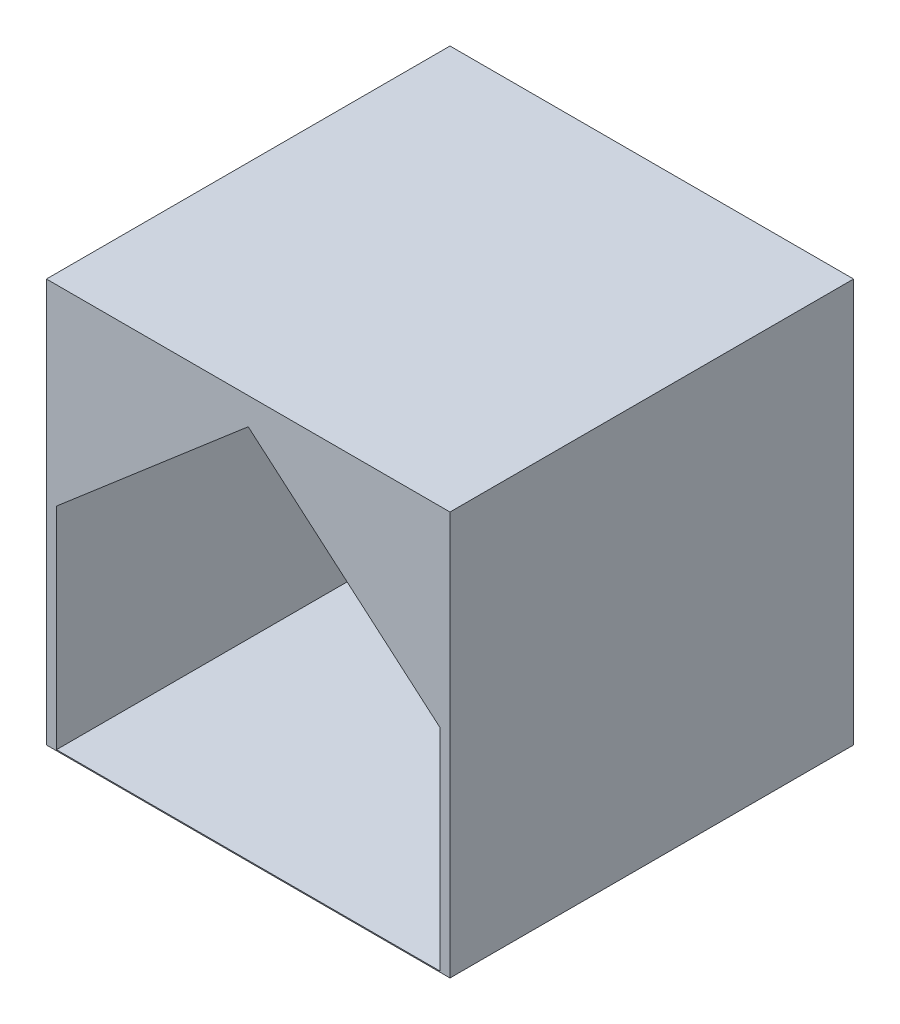
ISO-10303-21;
HEADER;
FILE_DESCRIPTION(('STEP AP214'),'2;1');
FILE_NAME('part.step','',(''),(''),'','','');
FILE_SCHEMA(('AUTOMOTIVE_DESIGN { 1 0 10303 214 1 1 1 1 }'));
ENDSEC;
DATA;
#1=APPLICATION_CONTEXT('core data for automotive mechanical design processes');
#2=APPLICATION_PROTOCOL_DEFINITION('international standard','automotive_design',2000,#1);
#3=PRODUCT_CONTEXT('',#1,'mechanical');
#4=PRODUCT('Part','Part','',(#3));
#5=PRODUCT_RELATED_PRODUCT_CATEGORY('part','',(#4));
#6=PRODUCT_DEFINITION_FORMATION('','',#4);
#7=PRODUCT_DEFINITION_CONTEXT('part definition',#1,'design');
#8=PRODUCT_DEFINITION('design','',#6,#7);
#9=PRODUCT_DEFINITION_SHAPE('','',#8);
#10=(LENGTH_UNIT() NAMED_UNIT(*) SI_UNIT(.MILLI.,.METRE.));
#11=(NAMED_UNIT(*) PLANE_ANGLE_UNIT() SI_UNIT($,.RADIAN.));
#12=(NAMED_UNIT(*) SI_UNIT($,.STERADIAN.) SOLID_ANGLE_UNIT());
#13=UNCERTAINTY_MEASURE_WITH_UNIT(LENGTH_MEASURE(1.E-05),#10,'distance_accuracy_value','');
#14=(GEOMETRIC_REPRESENTATION_CONTEXT(3) GLOBAL_UNCERTAINTY_ASSIGNED_CONTEXT((#13)) GLOBAL_UNIT_ASSIGNED_CONTEXT((#10,
#11,#12)) REPRESENTATION_CONTEXT('',''));
#15=CARTESIAN_POINT('',(0.,0.,0.));
#16=DIRECTION('',(0.,0.,1.));
#17=DIRECTION('',(1.,0.,0.));
#18=AXIS2_PLACEMENT_3D('',#15,#16,#17);
#19=CARTESIAN_POINT('',(0.,0.,2000.));
#20=DIRECTION('',(0.,0.,1.));
#21=DIRECTION('',(1.,0.,0.));
#22=AXIS2_PLACEMENT_3D('',#19,#20,#21);
#23=PLANE('',#22);
#24=DIRECTION('',(0.,-1.,0.));
#25=VECTOR('',#24,1.);
#26=CARTESIAN_POINT('',(-1000.,-1000.,2000.));
#27=LINE('',#26,#25);
#28=CARTESIAN_POINT('',(-1000.,1000.,2000.));
#29=VERTEX_POINT('',#28);
#30=CARTESIAN_POINT('',(-1000.,-1000.,2000.));
#31=VERTEX_POINT('',#30);
#32=EDGE_CURVE('E160',#29,#31,#27,.T.);
#33=ORIENTED_EDGE('',*,*,#32,.T.);
#34=DIRECTION('',(1.,0.,0.));
#35=VECTOR('',#34,1.);
#36=CARTESIAN_POINT('',(1000.,-1000.,2000.));
#37=LINE('',#36,#35);
#38=CARTESIAN_POINT('',(1000.,-1000.,2000.));
#39=VERTEX_POINT('',#38);
#40=EDGE_CURVE('E88',#31,#39,#37,.T.);
#41=ORIENTED_EDGE('',*,*,#40,.T.);
#42=DIRECTION('',(0.,1.,0.));
#43=VECTOR('',#42,1.);
#44=CARTESIAN_POINT('',(1000.,-1000.,2000.));
#45=LINE('',#44,#43);
#46=CARTESIAN_POINT('',(1000.,1000.,2000.));
#47=VERTEX_POINT('',#46);
#48=EDGE_CURVE('E163',#39,#47,#45,.T.);
#49=ORIENTED_EDGE('',*,*,#48,.T.);
#50=DIRECTION('',(-1.,0.,0.));
#51=VECTOR('',#50,1.);
#52=CARTESIAN_POINT('',(1000.,1000.,2000.));
#53=LINE('',#52,#51);
#54=EDGE_CURVE('E59',#47,#29,#53,.T.);
#55=ORIENTED_EDGE('',*,*,#54,.T.);
#56=EDGE_LOOP('',(#33,#41,#49,#55));
#57=FACE_BOUND('',#56,.T.);
#58=DIRECTION('',(0.,1.,0.));
#59=VECTOR('',#58,1.);
#60=CARTESIAN_POINT('',(950.,2.01762059646523E-13,2000.));
#61=LINE('',#60,#59);
#62=CARTESIAN_POINT('',(950.,-995.,2000.));
#63=VERTEX_POINT('',#62);
#64=CARTESIAN_POINT('',(950.,50.5007004207842,2000.));
#65=VERTEX_POINT('',#64);
#66=EDGE_CURVE('E43',#63,#65,#61,.T.);
#67=ORIENTED_EDGE('',*,*,#66,.F.);
#68=DIRECTION('',(-1.,0.,0.));
#69=VECTOR('',#68,1.);
#70=CARTESIAN_POINT('',(1.16281253631793E-13,-995.,2000.));
#71=LINE('',#70,#69);
#72=CARTESIAN_POINT('',(-950.,-995.,2000.));
#73=VERTEX_POINT('',#72);
#74=EDGE_CURVE('E12',#63,#73,#71,.T.);
#75=ORIENTED_EDGE('',*,*,#74,.T.);
#76=DIRECTION('',(0.,-1.,0.));
#77=VECTOR('',#76,1.);
#78=CARTESIAN_POINT('',(-950.,0.,2000.));
#79=LINE('',#78,#77);
#80=CARTESIAN_POINT('',(-950.,50.500700420784,2000.));
#81=VERTEX_POINT('',#80);
#82=EDGE_CURVE('E182',#81,#73,#79,.T.);
#83=ORIENTED_EDGE('',*,*,#82,.F.);
#84=DIRECTION('',(-0.75881654460311,-0.651304423166768,0.));
#85=VECTOR('',#84,1.);
#86=CARTESIAN_POINT('',(-427.946064096669,498.587975274946,2000.));
#87=LINE('',#86,#85);
#88=CARTESIAN_POINT('',(0.,865.900952838913,2000.));
#89=VERTEX_POINT('',#88);
#90=EDGE_CURVE('E184',#89,#81,#87,.T.);
#91=ORIENTED_EDGE('',*,*,#90,.F.);
#92=DIRECTION('',(-0.75881654460311,0.651304423166768,0.));
#93=VECTOR('',#92,1.);
#94=CARTESIAN_POINT('',(427.946064096669,498.587975274946,2000.));
#95=LINE('',#94,#93);
#96=EDGE_CURVE('E186',#65,#89,#95,.T.);
#97=ORIENTED_EDGE('',*,*,#96,.F.);
#98=EDGE_LOOP('',(#67,#75,#83,#91,#97));
#99=FACE_BOUND('',#98,.T.);
#100=ADVANCED_FACE('F35',(#57,#99),#23,.T.);
#101=CARTESIAN_POINT('',(-1000.,-1000.,2000.));
#102=DIRECTION('',(1.,0.,0.));
#103=DIRECTION('',(0.,0.,-1.));
#104=AXIS2_PLACEMENT_3D('',#101,#102,#103);
#105=PLANE('',#104);
#106=DIRECTION('',(0.,-1.,0.));
#107=VECTOR('',#106,1.);
#108=CARTESIAN_POINT('',(-1000.,-1000.,0.));
#109=LINE('',#108,#107);
#110=CARTESIAN_POINT('',(-1000.,1000.,0.));
#111=VERTEX_POINT('',#110);
#112=CARTESIAN_POINT('',(-1000.,-1000.,0.));
#113=VERTEX_POINT('',#112);
#114=EDGE_CURVE('E124',#111,#113,#109,.T.);
#115=ORIENTED_EDGE('',*,*,#114,.T.);
#116=DIRECTION('',(0.,0.,-1.));
#117=VECTOR('',#116,1.);
#118=CARTESIAN_POINT('',(-1000.,-1000.,2000.));
#119=LINE('',#118,#117);
#120=EDGE_CURVE('E180',#31,#113,#119,.T.);
#121=ORIENTED_EDGE('',*,*,#120,.F.);
#122=ORIENTED_EDGE('',*,*,#32,.F.);
#123=DIRECTION('',(0.,0.,-1.));
#124=VECTOR('',#123,1.);
#125=CARTESIAN_POINT('',(-1000.,1000.,2000.));
#126=LINE('',#125,#124);
#127=EDGE_CURVE('E166',#29,#111,#126,.T.);
#128=ORIENTED_EDGE('',*,*,#127,.T.);
#129=EDGE_LOOP('',(#115,#121,#122,#128));
#130=FACE_BOUND('',#129,.T.);
#131=ADVANCED_FACE('F37',(#130),#105,.F.);
#132=CARTESIAN_POINT('',(1000.,-1000.,2000.));
#133=DIRECTION('',(0.,1.,0.));
#134=DIRECTION('',(-1.,0.,0.));
#135=AXIS2_PLACEMENT_3D('',#132,#133,#134);
#136=PLANE('',#135);
#137=DIRECTION('',(1.,0.,0.));
#138=VECTOR('',#137,1.);
#139=CARTESIAN_POINT('',(1000.,-1000.,0.));
#140=LINE('',#139,#138);
#141=CARTESIAN_POINT('',(1000.,-1000.,0.));
#142=VERTEX_POINT('',#141);
#143=EDGE_CURVE('E169',#113,#142,#140,.T.);
#144=ORIENTED_EDGE('',*,*,#143,.T.);
#145=DIRECTION('',(0.,0.,-1.));
#146=VECTOR('',#145,1.);
#147=CARTESIAN_POINT('',(1000.,-1000.,2000.));
#148=LINE('',#147,#146);
#149=EDGE_CURVE('E177',#39,#142,#148,.T.);
#150=ORIENTED_EDGE('',*,*,#149,.F.);
#151=ORIENTED_EDGE('',*,*,#40,.F.);
#152=ORIENTED_EDGE('',*,*,#120,.T.);
#153=EDGE_LOOP('',(#144,#150,#151,#152));
#154=FACE_BOUND('',#153,.T.);
#155=ADVANCED_FACE('F212',(#154),#136,.F.);
#156=CARTESIAN_POINT('',(1000.,-1000.,2000.));
#157=DIRECTION('',(-1.,0.,0.));
#158=DIRECTION('',(0.,0.,1.));
#159=AXIS2_PLACEMENT_3D('',#156,#157,#158);
#160=PLANE('',#159);
#161=DIRECTION('',(0.,1.,0.));
#162=VECTOR('',#161,1.);
#163=CARTESIAN_POINT('',(1000.,-1000.,0.));
#164=LINE('',#163,#162);
#165=CARTESIAN_POINT('',(1000.,1000.,0.));
#166=VERTEX_POINT('',#165);
#167=EDGE_CURVE('E171',#142,#166,#164,.T.);
#168=ORIENTED_EDGE('',*,*,#167,.T.);
#169=DIRECTION('',(0.,0.,-1.));
#170=VECTOR('',#169,1.);
#171=CARTESIAN_POINT('',(1000.,1000.,2000.));
#172=LINE('',#171,#170);
#173=EDGE_CURVE('E175',#47,#166,#172,.T.);
#174=ORIENTED_EDGE('',*,*,#173,.F.);
#175=ORIENTED_EDGE('',*,*,#48,.F.);
#176=ORIENTED_EDGE('',*,*,#149,.T.);
#177=EDGE_LOOP('',(#168,#174,#175,#176));
#178=FACE_BOUND('',#177,.T.);
#179=ADVANCED_FACE('F224',(#178),#160,.F.);
#180=CARTESIAN_POINT('',(1000.,1000.,2000.));
#181=DIRECTION('',(0.,-1.,0.));
#182=DIRECTION('',(1.,0.,0.));
#183=AXIS2_PLACEMENT_3D('',#180,#181,#182);
#184=PLANE('',#183);
#185=DIRECTION('',(-1.,0.,0.));
#186=VECTOR('',#185,1.);
#187=CARTESIAN_POINT('',(1000.,1000.,0.));
#188=LINE('',#187,#186);
#189=EDGE_CURVE('E80',#166,#111,#188,.T.);
#190=ORIENTED_EDGE('',*,*,#189,.T.);
#191=ORIENTED_EDGE('',*,*,#127,.F.);
#192=ORIENTED_EDGE('',*,*,#54,.F.);
#193=ORIENTED_EDGE('',*,*,#173,.T.);
#194=EDGE_LOOP('',(#190,#191,#192,#193));
#195=FACE_BOUND('',#194,.T.);
#196=ADVANCED_FACE('F220',(#195),#184,.F.);
#197=CARTESIAN_POINT('',(0.,0.,0.));
#198=DIRECTION('',(0.,0.,1.));
#199=DIRECTION('',(1.,0.,0.));
#200=AXIS2_PLACEMENT_3D('',#197,#198,#199);
#201=PLANE('',#200);
#202=ORIENTED_EDGE('',*,*,#114,.F.);
#203=ORIENTED_EDGE('',*,*,#189,.F.);
#204=ORIENTED_EDGE('',*,*,#167,.F.);
#205=ORIENTED_EDGE('',*,*,#143,.F.);
#206=EDGE_LOOP('',(#202,#203,#204,#205));
#207=FACE_BOUND('',#206,.T.);
#208=ADVANCED_FACE('F217',(#207),#201,.F.);
#209=CARTESIAN_POINT('',(1.16281253631793E-13,-995.,2000.000012));
#210=DIRECTION('',(0.,1.,0.));
#211=DIRECTION('',(-1.,0.,0.));
#212=AXIS2_PLACEMENT_3D('',#209,#210,#211);
#213=PLANE('',#212);
#214=DIRECTION('',(0.,0.,-1.));
#215=VECTOR('',#214,1.);
#216=CARTESIAN_POINT('',(950.,-995.,2000.000012));
#217=LINE('',#216,#215);
#218=CARTESIAN_POINT('',(950.,-995.,4.99999999999989));
#219=VERTEX_POINT('',#218);
#220=EDGE_CURVE('E116',#63,#219,#217,.T.);
#221=ORIENTED_EDGE('',*,*,#220,.T.);
#222=DIRECTION('',(1.,0.,0.));
#223=VECTOR('',#222,1.);
#224=CARTESIAN_POINT('',(1.16281253631793E-13,-995.,4.99999999999989));
#225=LINE('',#224,#223);
#226=CARTESIAN_POINT('',(-950.,-995.,4.99999999999989));
#227=VERTEX_POINT('',#226);
#228=EDGE_CURVE('E121',#227,#219,#225,.T.);
#229=ORIENTED_EDGE('',*,*,#228,.F.);
#230=DIRECTION('',(0.,0.,-1.));
#231=VECTOR('',#230,1.);
#232=CARTESIAN_POINT('',(-950.,-995.,2000.000012));
#233=LINE('',#232,#231);
#234=EDGE_CURVE('E154',#73,#227,#233,.T.);
#235=ORIENTED_EDGE('',*,*,#234,.F.);
#236=ORIENTED_EDGE('',*,*,#74,.F.);
#237=EDGE_LOOP('',(#221,#229,#235,#236));
#238=FACE_BOUND('',#237,.T.);
#239=ADVANCED_FACE('F118',(#238),#213,.T.);
#240=CARTESIAN_POINT('',(950.,2.01762059646523E-13,2000.000012));
#241=DIRECTION('',(1.,0.,0.));
#242=DIRECTION('',(0.,1.,0.));
#243=AXIS2_PLACEMENT_3D('',#240,#241,#242);
#244=PLANE('',#243);
#245=ORIENTED_EDGE('',*,*,#66,.T.);
#246=DIRECTION('',(0.,0.,-1.));
#247=VECTOR('',#246,1.);
#248=CARTESIAN_POINT('',(950.,50.5007004207842,2000.000012));
#249=LINE('',#248,#247);
#250=CARTESIAN_POINT('',(950.,50.5007004207842,4.99999999999989));
#251=VERTEX_POINT('',#250);
#252=EDGE_CURVE('E125',#65,#251,#249,.T.);
#253=ORIENTED_EDGE('',*,*,#252,.T.);
#254=DIRECTION('',(0.,-1.,0.));
#255=VECTOR('',#254,1.);
#256=CARTESIAN_POINT('',(950.,2.01762059646523E-13,4.99999999999989));
#257=LINE('',#256,#255);
#258=EDGE_CURVE('E128',#251,#219,#257,.T.);
#259=ORIENTED_EDGE('',*,*,#258,.T.);
#260=ORIENTED_EDGE('',*,*,#220,.F.);
#261=EDGE_LOOP('',(#245,#253,#259,#260));
#262=FACE_BOUND('',#261,.T.);
#263=ADVANCED_FACE('F129',(#262),#244,.F.);
#264=CARTESIAN_POINT('',(427.946064096669,498.587975274946,2000.000012));
#265=DIRECTION('',(0.651304423166768,0.75881654460311,0.));
#266=DIRECTION('',(-0.75881654460311,0.651304423166768,0.));
#267=AXIS2_PLACEMENT_3D('',#264,#265,#266);
#268=PLANE('',#267);
#269=CARTESIAN_POINT('',(475.,458.200826629849,1500.));
#270=DIRECTION('',(-0.651304423166768,-0.758816544603111,0.));
#271=DIRECTION('',(0.758816544603111,-0.651304423166768,0.));
#272=AXIS2_PLACEMENT_3D('',#269,#270,#271);
#273=CIRCLE('',#272,100.);
#274=CARTESIAN_POINT('',(550.881654460311,393.070384313172,1500.));
#275=VERTEX_POINT('',#274);
#276=EDGE_CURVE('E143',#275,#275,#273,.T.);
#277=ORIENTED_EDGE('',*,*,#276,.F.);
#278=EDGE_LOOP('',(#277));
#279=FACE_BOUND('',#278,.T.);
#280=CARTESIAN_POINT('',(475.,458.200826629849,1002.5));
#281=DIRECTION('',(-0.651304423166768,-0.758816544603111,0.));
#282=DIRECTION('',(0.758816544603111,-0.651304423166768,0.));
#283=AXIS2_PLACEMENT_3D('',#280,#281,#282);
#284=CIRCLE('',#283,100.);
#285=CARTESIAN_POINT('',(550.881654460311,393.070384313172,1002.5));
#286=VERTEX_POINT('',#285);
#287=EDGE_CURVE('E375',#286,#286,#284,.T.);
#288=ORIENTED_EDGE('',*,*,#287,.F.);
#289=EDGE_LOOP('',(#288));
#290=FACE_BOUND('',#289,.T.);
#291=CARTESIAN_POINT('',(475.,458.200826629849,502.5));
#292=DIRECTION('',(-0.651304423166768,-0.758816544603111,0.));
#293=DIRECTION('',(0.758816544603111,-0.651304423166768,0.));
#294=AXIS2_PLACEMENT_3D('',#291,#292,#293);
#295=CIRCLE('',#294,100.);
#296=CARTESIAN_POINT('',(550.881654460311,393.070384313172,502.5));
#297=VERTEX_POINT('',#296);
#298=EDGE_CURVE('E146',#297,#297,#295,.T.);
#299=ORIENTED_EDGE('',*,*,#298,.F.);
#300=EDGE_LOOP('',(#299));
#301=FACE_BOUND('',#300,.T.);
#302=ORIENTED_EDGE('',*,*,#96,.T.);
#303=DIRECTION('',(0.,0.,-1.));
#304=VECTOR('',#303,1.);
#305=CARTESIAN_POINT('',(0.,865.900952838913,2000.000012));
#306=LINE('',#305,#304);
#307=CARTESIAN_POINT('',(0.,865.900952838913,4.99999999999989));
#308=VERTEX_POINT('',#307);
#309=EDGE_CURVE('E157',#89,#308,#306,.T.);
#310=ORIENTED_EDGE('',*,*,#309,.T.);
#311=DIRECTION('',(0.75881654460311,-0.651304423166768,0.));
#312=VECTOR('',#311,1.);
#313=CARTESIAN_POINT('',(427.946064096669,498.587975274946,4.99999999999989));
#314=LINE('',#313,#312);
#315=EDGE_CURVE('E134',#308,#251,#314,.T.);
#316=ORIENTED_EDGE('',*,*,#315,.T.);
#317=ORIENTED_EDGE('',*,*,#252,.F.);
#318=EDGE_LOOP('',(#302,#310,#316,#317));
#319=FACE_BOUND('',#318,.T.);
#320=ADVANCED_FACE('F190',(#279,#290,#301,#319),#268,.F.);
#321=CARTESIAN_POINT('',(-427.946064096669,498.587975274946,2000.000012));
#322=DIRECTION('',(-0.651304423166768,0.75881654460311,0.));
#323=DIRECTION('',(-0.75881654460311,-0.651304423166768,0.));
#324=AXIS2_PLACEMENT_3D('',#321,#322,#323);
#325=PLANE('',#324);
#326=CARTESIAN_POINT('',(-475.,458.200826629849,1500.));
#327=DIRECTION('',(0.651304423166768,-0.75881654460311,0.));
#328=DIRECTION('',(0.75881654460311,0.651304423166768,0.));
#329=AXIS2_PLACEMENT_3D('',#326,#327,#328);
#330=CIRCLE('',#329,100.);
#331=CARTESIAN_POINT('',(-399.118345539689,523.331268946525,1500.));
#332=VERTEX_POINT('',#331);
#333=EDGE_CURVE('E376',#332,#332,#330,.T.);
#334=ORIENTED_EDGE('',*,*,#333,.F.);
#335=EDGE_LOOP('',(#334));
#336=FACE_BOUND('',#335,.T.);
#337=CARTESIAN_POINT('',(-475.,458.200826629849,1000.));
#338=DIRECTION('',(0.651304423166768,-0.75881654460311,0.));
#339=DIRECTION('',(0.75881654460311,0.651304423166768,0.));
#340=AXIS2_PLACEMENT_3D('',#337,#338,#339);
#341=CIRCLE('',#340,100.);
#342=CARTESIAN_POINT('',(-399.118345539689,523.331268946525,1000.));
#343=VERTEX_POINT('',#342);
#344=EDGE_CURVE('E385',#343,#343,#341,.T.);
#345=ORIENTED_EDGE('',*,*,#344,.F.);
#346=EDGE_LOOP('',(#345));
#347=FACE_BOUND('',#346,.T.);
#348=CARTESIAN_POINT('',(-475.,458.200826629849,502.5));
#349=DIRECTION('',(0.651304423166768,-0.75881654460311,0.));
#350=DIRECTION('',(0.75881654460311,0.651304423166768,0.));
#351=AXIS2_PLACEMENT_3D('',#348,#349,#350);
#352=CIRCLE('',#351,100.);
#353=CARTESIAN_POINT('',(-399.118345539689,523.331268946525,502.5));
#354=VERTEX_POINT('',#353);
#355=EDGE_CURVE('E391',#354,#354,#352,.T.);
#356=ORIENTED_EDGE('',*,*,#355,.F.);
#357=EDGE_LOOP('',(#356));
#358=FACE_BOUND('',#357,.T.);
#359=ORIENTED_EDGE('',*,*,#90,.T.);
#360=DIRECTION('',(0.,0.,-1.));
#361=VECTOR('',#360,1.);
#362=CARTESIAN_POINT('',(-950.,50.500700420784,2000.000012));
#363=LINE('',#362,#361);
#364=CARTESIAN_POINT('',(-950.,50.500700420784,4.99999999999989));
#365=VERTEX_POINT('',#364);
#366=EDGE_CURVE('E50',#81,#365,#363,.T.);
#367=ORIENTED_EDGE('',*,*,#366,.T.);
#368=DIRECTION('',(0.75881654460311,0.651304423166768,0.));
#369=VECTOR('',#368,1.);
#370=CARTESIAN_POINT('',(-427.946064096669,498.587975274946,4.99999999999989));
#371=LINE('',#370,#369);
#372=EDGE_CURVE('E150',#365,#308,#371,.T.);
#373=ORIENTED_EDGE('',*,*,#372,.T.);
#374=ORIENTED_EDGE('',*,*,#309,.F.);
#375=EDGE_LOOP('',(#359,#367,#373,#374));
#376=FACE_BOUND('',#375,.T.);
#377=ADVANCED_FACE('F195',(#336,#347,#358,#376),#325,.F.);
#378=CARTESIAN_POINT('',(-950.,0.,2000.000012));
#379=DIRECTION('',(-1.,0.,0.));
#380=DIRECTION('',(0.,0.,1.));
#381=AXIS2_PLACEMENT_3D('',#378,#379,#380);
#382=PLANE('',#381);
#383=ORIENTED_EDGE('',*,*,#82,.T.);
#384=ORIENTED_EDGE('',*,*,#234,.T.);
#385=DIRECTION('',(0.,1.,0.));
#386=VECTOR('',#385,1.);
#387=CARTESIAN_POINT('',(-950.,0.,4.99999999999989));
#388=LINE('',#387,#386);
#389=EDGE_CURVE('E139',#227,#365,#388,.T.);
#390=ORIENTED_EDGE('',*,*,#389,.T.);
#391=ORIENTED_EDGE('',*,*,#366,.F.);
#392=EDGE_LOOP('',(#383,#384,#390,#391));
#393=FACE_BOUND('',#392,.T.);
#394=ADVANCED_FACE('F196',(#393),#382,.F.);
#395=CARTESIAN_POINT('',(0.,0.,4.99999999999989));
#396=DIRECTION('',(0.,0.,1.));
#397=DIRECTION('',(1.,0.,0.));
#398=AXIS2_PLACEMENT_3D('',#395,#396,#397);
#399=PLANE('',#398);
#400=ORIENTED_EDGE('',*,*,#228,.T.);
#401=ORIENTED_EDGE('',*,*,#258,.F.);
#402=ORIENTED_EDGE('',*,*,#315,.F.);
#403=ORIENTED_EDGE('',*,*,#372,.F.);
#404=ORIENTED_EDGE('',*,*,#389,.F.);
#405=EDGE_LOOP('',(#400,#401,#402,#403,#404));
#406=FACE_BOUND('',#405,.T.);
#407=ADVANCED_FACE('F137',(#406),#399,.T.);
#408=CARTESIAN_POINT('',(488.026088463335,473.377157521911,502.5));
#409=DIRECTION('',(-0.651304423166768,-0.758816544603111,0.));
#410=DIRECTION('',(0.758816544603111,-0.651304423166768,0.));
#411=AXIS2_PLACEMENT_3D('',#408,#409,#410);
#412=CYLINDRICAL_SURFACE('',#411,100.);
#413=CARTESIAN_POINT('',(488.026088463335,473.377157521911,502.5));
#414=DIRECTION('',(-0.651304423166768,-0.758816544603111,0.));
#415=DIRECTION('',(0.758816544603111,-0.651304423166768,0.));
#416=AXIS2_PLACEMENT_3D('',#413,#414,#415);
#417=CIRCLE('',#416,100.);
#418=CARTESIAN_POINT('',(563.907742923647,408.246715205234,502.5));
#419=VERTEX_POINT('',#418);
#420=EDGE_CURVE('E370',#419,#419,#417,.T.);
#421=ORIENTED_EDGE('',*,*,#420,.F.);
#422=EDGE_LOOP('',(#421));
#423=FACE_BOUND('',#422,.T.);
#424=ORIENTED_EDGE('',*,*,#298,.T.);
#425=EDGE_LOOP('',(#424));
#426=FACE_BOUND('',#425,.T.);
#427=ADVANCED_FACE('F203',(#423,#426),#412,.F.);
#428=CARTESIAN_POINT('',(488.026088463335,473.377157521911,502.5));
#429=DIRECTION('',(-0.651304423166768,-0.758816544603111,0.));
#430=DIRECTION('',(0.758816544603111,-0.651304423166768,0.));
#431=AXIS2_PLACEMENT_3D('',#428,#429,#430);
#432=PLANE('',#431);
#433=ORIENTED_EDGE('',*,*,#420,.T.);
#434=EDGE_LOOP('',(#433));
#435=FACE_BOUND('',#434,.T.);
#436=ADVANCED_FACE('F359',(#435),#432,.T.);
#437=CARTESIAN_POINT('',(488.026088463335,473.377157521911,1002.5));
#438=DIRECTION('',(-0.651304423166768,-0.758816544603111,0.));
#439=DIRECTION('',(0.758816544603111,-0.651304423166768,0.));
#440=AXIS2_PLACEMENT_3D('',#437,#438,#439);
#441=CYLINDRICAL_SURFACE('',#440,100.);
#442=CARTESIAN_POINT('',(488.026088463335,473.377157521911,1002.5));
#443=DIRECTION('',(-0.651304423166768,-0.758816544603111,0.));
#444=DIRECTION('',(0.758816544603111,-0.651304423166768,0.));
#445=AXIS2_PLACEMENT_3D('',#442,#443,#444);
#446=CIRCLE('',#445,100.);
#447=CARTESIAN_POINT('',(563.907742923646,408.246715205234,1002.5));
#448=VERTEX_POINT('',#447);
#449=EDGE_CURVE('E396',#448,#448,#446,.T.);
#450=ORIENTED_EDGE('',*,*,#449,.F.);
#451=EDGE_LOOP('',(#450));
#452=FACE_BOUND('',#451,.T.);
#453=ORIENTED_EDGE('',*,*,#287,.T.);
#454=EDGE_LOOP('',(#453));
#455=FACE_BOUND('',#454,.T.);
#456=ADVANCED_FACE('F355',(#452,#455),#441,.F.);
#457=CARTESIAN_POINT('',(488.026088463335,473.377157521911,1002.5));
#458=DIRECTION('',(-0.651304423166768,-0.758816544603111,0.));
#459=DIRECTION('',(0.758816544603111,-0.651304423166768,0.));
#460=AXIS2_PLACEMENT_3D('',#457,#458,#459);
#461=PLANE('',#460);
#462=ORIENTED_EDGE('',*,*,#449,.T.);
#463=EDGE_LOOP('',(#462));
#464=FACE_BOUND('',#463,.T.);
#465=ADVANCED_FACE('F351',(#464),#461,.T.);
#466=CARTESIAN_POINT('',(488.026088463335,473.377157521911,1500.));
#467=DIRECTION('',(-0.651304423166768,-0.758816544603111,0.));
#468=DIRECTION('',(0.758816544603111,-0.651304423166768,0.));
#469=AXIS2_PLACEMENT_3D('',#466,#467,#468);
#470=CYLINDRICAL_SURFACE('',#469,100.);
#471=CARTESIAN_POINT('',(488.026088463335,473.377157521911,1500.));
#472=DIRECTION('',(-0.651304423166768,-0.758816544603111,0.));
#473=DIRECTION('',(0.758816544603111,-0.651304423166768,0.));
#474=AXIS2_PLACEMENT_3D('',#471,#472,#473);
#475=CIRCLE('',#474,100.);
#476=CARTESIAN_POINT('',(563.907742923647,408.246715205234,1500.));
#477=VERTEX_POINT('',#476);
#478=EDGE_CURVE('E140',#477,#477,#475,.T.);
#479=ORIENTED_EDGE('',*,*,#478,.F.);
#480=EDGE_LOOP('',(#479));
#481=FACE_BOUND('',#480,.T.);
#482=ORIENTED_EDGE('',*,*,#276,.T.);
#483=EDGE_LOOP('',(#482));
#484=FACE_BOUND('',#483,.T.);
#485=ADVANCED_FACE('F347',(#481,#484),#470,.F.);
#486=CARTESIAN_POINT('',(488.026088463335,473.377157521911,1500.));
#487=DIRECTION('',(-0.651304423166768,-0.758816544603111,0.));
#488=DIRECTION('',(0.758816544603111,-0.651304423166768,0.));
#489=AXIS2_PLACEMENT_3D('',#486,#487,#488);
#490=PLANE('',#489);
#491=ORIENTED_EDGE('',*,*,#478,.T.);
#492=EDGE_LOOP('',(#491));
#493=FACE_BOUND('',#492,.T.);
#494=ADVANCED_FACE('F280',(#493),#490,.T.);
#495=CARTESIAN_POINT('',(-488.026088463335,473.377157521911,502.5));
#496=DIRECTION('',(0.651304423166768,-0.75881654460311,0.));
#497=DIRECTION('',(0.75881654460311,0.651304423166768,0.));
#498=AXIS2_PLACEMENT_3D('',#495,#496,#497);
#499=CYLINDRICAL_SURFACE('',#498,100.);
#500=CARTESIAN_POINT('',(-488.026088463335,473.377157521911,502.5));
#501=DIRECTION('',(0.651304423166768,-0.75881654460311,0.));
#502=DIRECTION('',(0.75881654460311,0.651304423166768,0.));
#503=AXIS2_PLACEMENT_3D('',#500,#501,#502);
#504=CIRCLE('',#503,100.);
#505=CARTESIAN_POINT('',(-412.144434003024,538.507599838588,502.5));
#506=VERTEX_POINT('',#505);
#507=EDGE_CURVE('E388',#506,#506,#504,.T.);
#508=ORIENTED_EDGE('',*,*,#507,.F.);
#509=EDGE_LOOP('',(#508));
#510=FACE_BOUND('',#509,.T.);
#511=ORIENTED_EDGE('',*,*,#355,.T.);
#512=EDGE_LOOP('',(#511));
#513=FACE_BOUND('',#512,.T.);
#514=ADVANCED_FACE('F285',(#510,#513),#499,.F.);
#515=CARTESIAN_POINT('',(-488.026088463335,473.377157521911,502.5));
#516=DIRECTION('',(0.651304423166768,-0.75881654460311,0.));
#517=DIRECTION('',(0.75881654460311,0.651304423166768,0.));
#518=AXIS2_PLACEMENT_3D('',#515,#516,#517);
#519=PLANE('',#518);
#520=ORIENTED_EDGE('',*,*,#507,.T.);
#521=EDGE_LOOP('',(#520));
#522=FACE_BOUND('',#521,.T.);
#523=ADVANCED_FACE('F290',(#522),#519,.T.);
#524=CARTESIAN_POINT('',(-488.026088463335,473.377157521911,1000.));
#525=DIRECTION('',(0.651304423166768,-0.75881654460311,0.));
#526=DIRECTION('',(0.75881654460311,0.651304423166768,0.));
#527=AXIS2_PLACEMENT_3D('',#524,#525,#526);
#528=CYLINDRICAL_SURFACE('',#527,100.);
#529=CARTESIAN_POINT('',(-488.026088463335,473.377157521911,1000.));
#530=DIRECTION('',(0.651304423166768,-0.75881654460311,0.));
#531=DIRECTION('',(0.75881654460311,0.651304423166768,0.));
#532=AXIS2_PLACEMENT_3D('',#529,#530,#531);
#533=CIRCLE('',#532,100.);
#534=CARTESIAN_POINT('',(-412.144434003024,538.507599838588,1000.));
#535=VERTEX_POINT('',#534);
#536=EDGE_CURVE('E380',#535,#535,#533,.T.);
#537=ORIENTED_EDGE('',*,*,#536,.F.);
#538=EDGE_LOOP('',(#537));
#539=FACE_BOUND('',#538,.T.);
#540=ORIENTED_EDGE('',*,*,#344,.T.);
#541=EDGE_LOOP('',(#540));
#542=FACE_BOUND('',#541,.T.);
#543=ADVANCED_FACE('F300',(#539,#542),#528,.F.);
#544=CARTESIAN_POINT('',(-488.026088463335,473.377157521911,1000.));
#545=DIRECTION('',(0.651304423166768,-0.75881654460311,0.));
#546=DIRECTION('',(0.75881654460311,0.651304423166768,0.));
#547=AXIS2_PLACEMENT_3D('',#544,#545,#546);
#548=PLANE('',#547);
#549=ORIENTED_EDGE('',*,*,#536,.T.);
#550=EDGE_LOOP('',(#549));
#551=FACE_BOUND('',#550,.T.);
#552=ADVANCED_FACE('F310',(#551),#548,.T.);
#553=CARTESIAN_POINT('',(-488.026088463335,473.377157521911,1500.));
#554=DIRECTION('',(0.651304423166768,-0.75881654460311,0.));
#555=DIRECTION('',(0.75881654460311,0.651304423166768,0.));
#556=AXIS2_PLACEMENT_3D('',#553,#554,#555);
#557=CYLINDRICAL_SURFACE('',#556,100.);
#558=CARTESIAN_POINT('',(-488.026088463335,473.377157521911,1500.));
#559=DIRECTION('',(0.651304423166768,-0.75881654460311,0.));
#560=DIRECTION('',(0.75881654460311,0.651304423166768,0.));
#561=AXIS2_PLACEMENT_3D('',#558,#559,#560);
#562=CIRCLE('',#561,100.);
#563=CARTESIAN_POINT('',(-412.144434003024,538.507599838588,1500.));
#564=VERTEX_POINT('',#563);
#565=EDGE_CURVE('E374',#564,#564,#562,.T.);
#566=ORIENTED_EDGE('',*,*,#565,.F.);
#567=EDGE_LOOP('',(#566));
#568=FACE_BOUND('',#567,.T.);
#569=ORIENTED_EDGE('',*,*,#333,.T.);
#570=EDGE_LOOP('',(#569));
#571=FACE_BOUND('',#570,.T.);
#572=ADVANCED_FACE('F320',(#568,#571),#557,.F.);
#573=CARTESIAN_POINT('',(-488.026088463335,473.377157521911,1500.));
#574=DIRECTION('',(0.651304423166768,-0.75881654460311,0.));
#575=DIRECTION('',(0.75881654460311,0.651304423166768,0.));
#576=AXIS2_PLACEMENT_3D('',#573,#574,#575);
#577=PLANE('',#576);
#578=ORIENTED_EDGE('',*,*,#565,.T.);
#579=EDGE_LOOP('',(#578));
#580=FACE_BOUND('',#579,.T.);
#581=ADVANCED_FACE('F330',(#580),#577,.T.);
#582=CLOSED_SHELL('',(#100,#131,#155,#179,#196,#208,#239,#263,#320,#377,#394,#407,#427,#436,
#456,#465,#485,#494,#514,#523,#543,#552,#572,#581));
#583=MANIFOLD_SOLID_BREP('B2',#582);
#584=ADVANCED_BREP_SHAPE_REPRESENTATION('',(#18,#583),#14);
#585=SHAPE_DEFINITION_REPRESENTATION(#9,#584);
ENDSEC;
END-ISO-10303-21;
